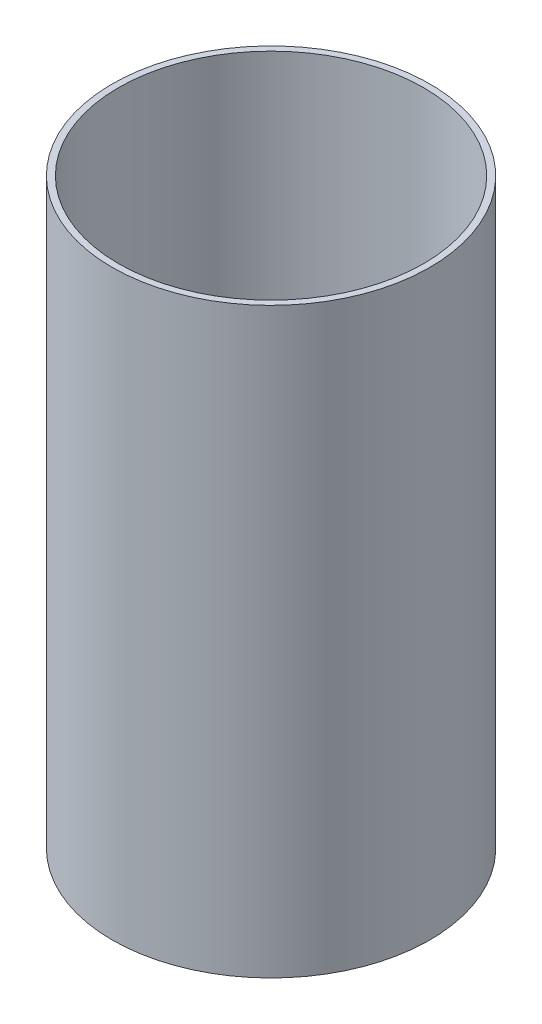
ISO-10303-21;
HEADER;
FILE_DESCRIPTION(('STEP AP214'),'2;1');
FILE_NAME('part.step','',(''),(''),'','','');
FILE_SCHEMA(('AUTOMOTIVE_DESIGN { 1 0 10303 214 1 1 1 1 }'));
ENDSEC;
DATA;
#1=APPLICATION_CONTEXT('core data for automotive mechanical design processes');
#2=APPLICATION_PROTOCOL_DEFINITION('international standard','automotive_design',2000,#1);
#3=PRODUCT_CONTEXT('',#1,'mechanical');
#4=PRODUCT('Part','Part','',(#3));
#5=PRODUCT_RELATED_PRODUCT_CATEGORY('part','',(#4));
#6=PRODUCT_DEFINITION_FORMATION('','',#4);
#7=PRODUCT_DEFINITION_CONTEXT('part definition',#1,'design');
#8=PRODUCT_DEFINITION('design','',#6,#7);
#9=PRODUCT_DEFINITION_SHAPE('','',#8);
#10=(LENGTH_UNIT() NAMED_UNIT(*) SI_UNIT(.MILLI.,.METRE.));
#11=(NAMED_UNIT(*) PLANE_ANGLE_UNIT() SI_UNIT($,.RADIAN.));
#12=(NAMED_UNIT(*) SI_UNIT($,.STERADIAN.) SOLID_ANGLE_UNIT());
#13=UNCERTAINTY_MEASURE_WITH_UNIT(LENGTH_MEASURE(1.E-05),#10,'distance_accuracy_value','');
#14=(GEOMETRIC_REPRESENTATION_CONTEXT(3) GLOBAL_UNCERTAINTY_ASSIGNED_CONTEXT((#13)) GLOBAL_UNIT_ASSIGNED_CONTEXT((#10,
#11,#12)) REPRESENTATION_CONTEXT('',''));
#15=CARTESIAN_POINT('',(0.,0.,0.));
#16=DIRECTION('',(0.,0.,1.));
#17=DIRECTION('',(1.,0.,0.));
#18=AXIS2_PLACEMENT_3D('',#15,#16,#17);
#19=CARTESIAN_POINT('',(0.,69.85,0.));
#20=DIRECTION('',(0.,1.,0.));
#21=DIRECTION('',(0.,0.,1.));
#22=AXIS2_PLACEMENT_3D('',#19,#20,#21);
#23=PLANE('',#22);
#24=CARTESIAN_POINT('',(0.,69.85,0.));
#25=DIRECTION('',(0.,1.,0.));
#26=DIRECTION('',(0.,0.,1.));
#27=AXIS2_PLACEMENT_3D('',#24,#25,#26);
#28=CIRCLE('',#27,38.1);
#29=CARTESIAN_POINT('',(0.,69.85,38.1));
#30=VERTEX_POINT('',#29);
#31=EDGE_CURVE('E10',#30,#30,#28,.T.);
#32=ORIENTED_EDGE('',*,*,#31,.T.);
#33=EDGE_LOOP('',(#32));
#34=FACE_BOUND('',#33,.T.);
#35=CARTESIAN_POINT('',(0.,69.85,0.));
#36=DIRECTION('',(0.,1.,0.));
#37=DIRECTION('',(0.,0.,1.));
#38=AXIS2_PLACEMENT_3D('',#35,#36,#37);
#39=CIRCLE('',#38,36.576);
#40=CARTESIAN_POINT('',(0.,69.85,36.576));
#41=VERTEX_POINT('',#40);
#42=EDGE_CURVE('E48',#41,#41,#39,.T.);
#43=ORIENTED_EDGE('',*,*,#42,.F.);
#44=EDGE_LOOP('',(#43));
#45=FACE_BOUND('',#44,.T.);
#46=ADVANCED_FACE('F37',(#34,#45),#23,.T.);
#47=CARTESIAN_POINT('',(0.,-69.85,0.));
#48=DIRECTION('',(0.,1.,0.));
#49=DIRECTION('',(0.,0.,1.));
#50=AXIS2_PLACEMENT_3D('',#47,#48,#49);
#51=PLANE('',#50);
#52=CARTESIAN_POINT('',(0.,-69.85,0.));
#53=DIRECTION('',(0.,1.,0.));
#54=DIRECTION('',(0.,0.,1.));
#55=AXIS2_PLACEMENT_3D('',#52,#53,#54);
#56=CIRCLE('',#55,38.1);
#57=CARTESIAN_POINT('',(0.,-69.85,38.1));
#58=VERTEX_POINT('',#57);
#59=EDGE_CURVE('E41',#58,#58,#56,.T.);
#60=ORIENTED_EDGE('',*,*,#59,.F.);
#61=EDGE_LOOP('',(#60));
#62=FACE_BOUND('',#61,.T.);
#63=CARTESIAN_POINT('',(0.,-69.85,0.));
#64=DIRECTION('',(0.,1.,0.));
#65=DIRECTION('',(0.,0.,1.));
#66=AXIS2_PLACEMENT_3D('',#63,#64,#65);
#67=CIRCLE('',#66,36.576);
#68=CARTESIAN_POINT('',(0.,-69.85,36.576));
#69=VERTEX_POINT('',#68);
#70=EDGE_CURVE('E50',#69,#69,#67,.T.);
#71=ORIENTED_EDGE('',*,*,#70,.T.);
#72=EDGE_LOOP('',(#71));
#73=FACE_BOUND('',#72,.T.);
#74=ADVANCED_FACE('F60',(#62,#73),#51,.F.);
#75=CARTESIAN_POINT('',(0.,69.85,0.));
#76=DIRECTION('',(0.,-1.,0.));
#77=DIRECTION('',(0.,0.,-1.));
#78=AXIS2_PLACEMENT_3D('',#75,#76,#77);
#79=CYLINDRICAL_SURFACE('',#78,38.1);
#80=ORIENTED_EDGE('',*,*,#31,.F.);
#81=EDGE_LOOP('',(#80));
#82=FACE_BOUND('',#81,.T.);
#83=ORIENTED_EDGE('',*,*,#59,.T.);
#84=EDGE_LOOP('',(#83));
#85=FACE_BOUND('',#84,.T.);
#86=ADVANCED_FACE('F39',(#82,#85),#79,.T.);
#87=CARTESIAN_POINT('',(0.,69.85,0.));
#88=DIRECTION('',(0.,-1.,0.));
#89=DIRECTION('',(0.,0.,-1.));
#90=AXIS2_PLACEMENT_3D('',#87,#88,#89);
#91=CYLINDRICAL_SURFACE('',#90,36.576);
#92=ORIENTED_EDGE('',*,*,#42,.T.);
#93=EDGE_LOOP('',(#92));
#94=FACE_BOUND('',#93,.T.);
#95=ORIENTED_EDGE('',*,*,#70,.F.);
#96=EDGE_LOOP('',(#95));
#97=FACE_BOUND('',#96,.T.);
#98=ADVANCED_FACE('F56',(#94,#97),#91,.F.);
#99=CLOSED_SHELL('',(#46,#74,#86,#98));
#100=MANIFOLD_SOLID_BREP('B2',#99);
#101=ADVANCED_BREP_SHAPE_REPRESENTATION('',(#18,#100),#14);
#102=SHAPE_DEFINITION_REPRESENTATION(#9,#101);
ENDSEC;
END-ISO-10303-21;
